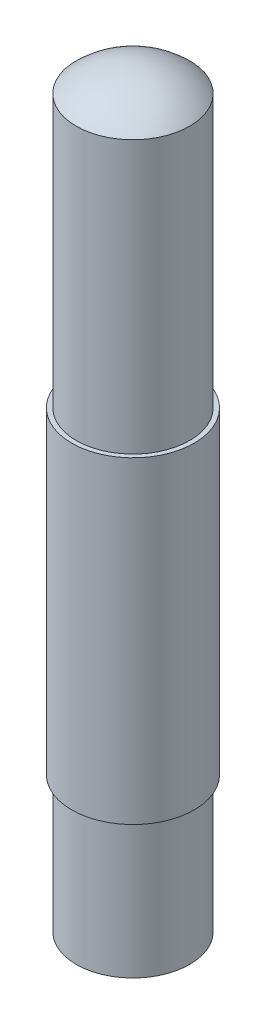
ISO-10303-21;
HEADER;
FILE_DESCRIPTION(('STEP AP214'),'2;1');
FILE_NAME('part.step','',(''),(''),'','','');
FILE_SCHEMA(('AUTOMOTIVE_DESIGN { 1 0 10303 214 1 1 1 1 }'));
ENDSEC;
DATA;
#1=APPLICATION_CONTEXT('core data for automotive mechanical design processes');
#2=APPLICATION_PROTOCOL_DEFINITION('international standard','automotive_design',2000,#1);
#3=PRODUCT_CONTEXT('',#1,'mechanical');
#4=PRODUCT('Part','Part','',(#3));
#5=PRODUCT_RELATED_PRODUCT_CATEGORY('part','',(#4));
#6=PRODUCT_DEFINITION_FORMATION('','',#4);
#7=PRODUCT_DEFINITION_CONTEXT('part definition',#1,'design');
#8=PRODUCT_DEFINITION('design','',#6,#7);
#9=PRODUCT_DEFINITION_SHAPE('','',#8);
#10=(LENGTH_UNIT() NAMED_UNIT(*) SI_UNIT(.MILLI.,.METRE.));
#11=(NAMED_UNIT(*) PLANE_ANGLE_UNIT() SI_UNIT($,.RADIAN.));
#12=(NAMED_UNIT(*) SI_UNIT($,.STERADIAN.) SOLID_ANGLE_UNIT());
#13=UNCERTAINTY_MEASURE_WITH_UNIT(LENGTH_MEASURE(1.E-05),#10,'distance_accuracy_value','');
#14=(GEOMETRIC_REPRESENTATION_CONTEXT(3) GLOBAL_UNCERTAINTY_ASSIGNED_CONTEXT((#13)) GLOBAL_UNIT_ASSIGNED_CONTEXT((#10,
#11,#12)) REPRESENTATION_CONTEXT('',''));
#15=CARTESIAN_POINT('',(0.,0.,0.));
#16=DIRECTION('',(0.,0.,1.));
#17=DIRECTION('',(1.,0.,0.));
#18=AXIS2_PLACEMENT_3D('',#15,#16,#17);
#19=CARTESIAN_POINT('',(0.,0.,0.));
#20=DIRECTION('',(0.,-1.,0.));
#21=DIRECTION('',(0.,0.,-1.));
#22=AXIS2_PLACEMENT_3D('',#19,#20,#21);
#23=PLANE('',#22);
#24=CARTESIAN_POINT('',(0.,0.,0.));
#25=DIRECTION('',(0.,1.,0.));
#26=DIRECTION('',(0.,0.,1.));
#27=AXIS2_PLACEMENT_3D('',#24,#25,#26);
#28=CIRCLE('',#27,12.5);
#29=CARTESIAN_POINT('',(0.,0.,12.5));
#30=VERTEX_POINT('',#29);
#31=EDGE_CURVE('E10',#30,#30,#28,.T.);
#32=ORIENTED_EDGE('',*,*,#31,.F.);
#33=EDGE_LOOP('',(#32));
#34=FACE_BOUND('',#33,.T.);
#35=ADVANCED_FACE('F43',(#34),#23,.T.);
#36=CARTESIAN_POINT('',(0.,160.,0.));
#37=DIRECTION('',(0.,1.,0.));
#38=DIRECTION('',(0.,0.,1.));
#39=AXIS2_PLACEMENT_3D('',#36,#37,#38);
#40=CYLINDRICAL_SURFACE('',#39,12.5);
#41=ORIENTED_EDGE('',*,*,#31,.T.);
#42=EDGE_LOOP('',(#41));
#43=FACE_BOUND('',#42,.T.);
#44=CARTESIAN_POINT('',(0.,30.,0.));
#45=DIRECTION('',(0.,1.,0.));
#46=DIRECTION('',(0.,0.,1.));
#47=AXIS2_PLACEMENT_3D('',#44,#45,#46);
#48=CIRCLE('',#47,12.5);
#49=CARTESIAN_POINT('',(0.,30.,12.5));
#50=VERTEX_POINT('',#49);
#51=EDGE_CURVE('E52',#50,#50,#48,.T.);
#52=ORIENTED_EDGE('',*,*,#51,.F.);
#53=EDGE_LOOP('',(#52));
#54=FACE_BOUND('',#53,.T.);
#55=ADVANCED_FACE('F89',(#43,#54),#40,.T.);
#56=CARTESIAN_POINT('',(-12.5,30.,0.));
#57=DIRECTION('',(0.,-1.,0.));
#58=DIRECTION('',(0.,0.,-1.));
#59=AXIS2_PLACEMENT_3D('',#56,#57,#58);
#60=PLANE('',#59);
#61=ORIENTED_EDGE('',*,*,#51,.T.);
#62=EDGE_LOOP('',(#61));
#63=FACE_BOUND('',#62,.T.);
#64=CARTESIAN_POINT('',(0.,30.,0.));
#65=DIRECTION('',(0.,1.,0.));
#66=DIRECTION('',(0.,0.,1.));
#67=AXIS2_PLACEMENT_3D('',#64,#65,#66);
#68=CIRCLE('',#67,13.5);
#69=CARTESIAN_POINT('',(0.,30.,13.5));
#70=VERTEX_POINT('',#69);
#71=EDGE_CURVE('E57',#70,#70,#68,.T.);
#72=ORIENTED_EDGE('',*,*,#71,.F.);
#73=EDGE_LOOP('',(#72));
#74=FACE_BOUND('',#73,.T.);
#75=ADVANCED_FACE('F94',(#63,#74),#60,.T.);
#76=CARTESIAN_POINT('',(0.,160.,0.));
#77=DIRECTION('',(0.,1.,0.));
#78=DIRECTION('',(0.,0.,1.));
#79=AXIS2_PLACEMENT_3D('',#76,#77,#78);
#80=CYLINDRICAL_SURFACE('',#79,13.5);
#81=ORIENTED_EDGE('',*,*,#71,.T.);
#82=EDGE_LOOP('',(#81));
#83=FACE_BOUND('',#82,.T.);
#84=CARTESIAN_POINT('',(0.,100.,0.));
#85=DIRECTION('',(0.,1.,0.));
#86=DIRECTION('',(0.,0.,1.));
#87=AXIS2_PLACEMENT_3D('',#84,#85,#86);
#88=CIRCLE('',#87,13.5);
#89=CARTESIAN_POINT('',(0.,100.,13.5));
#90=VERTEX_POINT('',#89);
#91=EDGE_CURVE('E63',#90,#90,#88,.T.);
#92=ORIENTED_EDGE('',*,*,#91,.F.);
#93=EDGE_LOOP('',(#92));
#94=FACE_BOUND('',#93,.T.);
#95=ADVANCED_FACE('F85',(#83,#94),#80,.T.);
#96=CARTESIAN_POINT('',(-13.5,100.,0.));
#97=DIRECTION('',(0.,1.,0.));
#98=DIRECTION('',(0.,0.,1.));
#99=AXIS2_PLACEMENT_3D('',#96,#97,#98);
#100=PLANE('',#99);
#101=ORIENTED_EDGE('',*,*,#91,.T.);
#102=EDGE_LOOP('',(#101));
#103=FACE_BOUND('',#102,.T.);
#104=CARTESIAN_POINT('',(0.,100.,0.));
#105=DIRECTION('',(0.,1.,0.));
#106=DIRECTION('',(0.,0.,1.));
#107=AXIS2_PLACEMENT_3D('',#104,#105,#106);
#108=CIRCLE('',#107,12.5);
#109=CARTESIAN_POINT('',(0.,100.,12.5));
#110=VERTEX_POINT('',#109);
#111=EDGE_CURVE('E67',#110,#110,#108,.T.);
#112=ORIENTED_EDGE('',*,*,#111,.F.);
#113=EDGE_LOOP('',(#112));
#114=FACE_BOUND('',#113,.T.);
#115=ADVANCED_FACE('F79',(#103,#114),#100,.T.);
#116=CARTESIAN_POINT('',(0.,160.,0.));
#117=DIRECTION('',(0.,1.,0.));
#118=DIRECTION('',(0.,0.,1.));
#119=AXIS2_PLACEMENT_3D('',#116,#117,#118);
#120=CYLINDRICAL_SURFACE('',#119,12.5);
#121=ORIENTED_EDGE('',*,*,#111,.T.);
#122=EDGE_LOOP('',(#121));
#123=FACE_BOUND('',#122,.T.);
#124=CARTESIAN_POINT('',(0.,160.,0.));
#125=DIRECTION('',(0.,1.,0.));
#126=DIRECTION('',(0.,0.,1.));
#127=AXIS2_PLACEMENT_3D('',#124,#125,#126);
#128=CIRCLE('',#127,12.5);
#129=CARTESIAN_POINT('',(0.,160.,12.5));
#130=VERTEX_POINT('',#129);
#131=EDGE_CURVE('E47',#130,#130,#128,.T.);
#132=ORIENTED_EDGE('',*,*,#131,.F.);
#133=EDGE_LOOP('',(#132));
#134=FACE_BOUND('',#133,.T.);
#135=ADVANCED_FACE('F77',(#123,#134),#120,.T.);
#136=CARTESIAN_POINT('',(0.,146.875,0.));
#137=DIRECTION('',(0.,0.,1.));
#138=DIRECTION('',(1.,0.,0.));
#139=AXIS2_PLACEMENT_3D('',#136,#137,#138);
#140=SPHERICAL_SURFACE('',#139,18.125);
#141=CARTESIAN_POINT('',(0.,146.875,0.));
#142=DIRECTION('',(0.,1.,0.));
#143=DIRECTION('',(0.,0.,1.));
#144=AXIS2_PLACEMENT_3D('',#141,#142,#143);
#145=SPHERICAL_SURFACE('',#144,18.125);
#146=ORIENTED_EDGE('',*,*,#131,.T.);
#147=EDGE_LOOP('',(#146));
#148=FACE_BOUND('',#147,.T.);
#149=ADVANCED_FACE('F45',(#148),#145,.T.);
#150=CLOSED_SHELL('',(#35,#55,#75,#95,#115,#135,#149));
#151=MANIFOLD_SOLID_BREP('B2',#150);
#152=ADVANCED_BREP_SHAPE_REPRESENTATION('',(#18,#151),#14);
#153=SHAPE_DEFINITION_REPRESENTATION(#9,#152);
ENDSEC;
END-ISO-10303-21;
